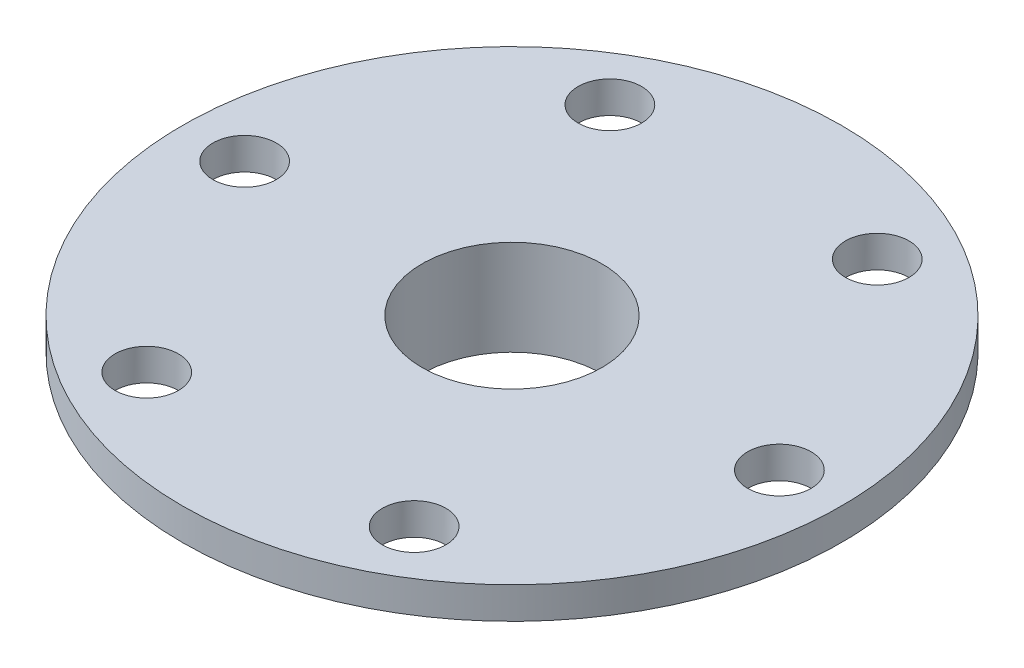
ISO-10303-21;
HEADER;
FILE_DESCRIPTION(('STEP AP214'),'2;1');
FILE_NAME('part.step','',(''),(''),'','','');
FILE_SCHEMA(('AUTOMOTIVE_DESIGN { 1 0 10303 214 1 1 1 1 }'));
ENDSEC;
DATA;
#1=APPLICATION_CONTEXT('core data for automotive mechanical design processes');
#2=APPLICATION_PROTOCOL_DEFINITION('international standard','automotive_design',2000,#1);
#3=PRODUCT_CONTEXT('',#1,'mechanical');
#4=PRODUCT('Part','Part','',(#3));
#5=PRODUCT_RELATED_PRODUCT_CATEGORY('part','',(#4));
#6=PRODUCT_DEFINITION_FORMATION('','',#4);
#7=PRODUCT_DEFINITION_CONTEXT('part definition',#1,'design');
#8=PRODUCT_DEFINITION('design','',#6,#7);
#9=PRODUCT_DEFINITION_SHAPE('','',#8);
#10=(LENGTH_UNIT() NAMED_UNIT(*) SI_UNIT(.MILLI.,.METRE.));
#11=(NAMED_UNIT(*) PLANE_ANGLE_UNIT() SI_UNIT($,.RADIAN.));
#12=(NAMED_UNIT(*) SI_UNIT($,.STERADIAN.) SOLID_ANGLE_UNIT());
#13=UNCERTAINTY_MEASURE_WITH_UNIT(LENGTH_MEASURE(1.E-05),#10,'distance_accuracy_value','');
#14=(GEOMETRIC_REPRESENTATION_CONTEXT(3) GLOBAL_UNCERTAINTY_ASSIGNED_CONTEXT((#13)) GLOBAL_UNIT_ASSIGNED_CONTEXT((#10,
#11,#12)) REPRESENTATION_CONTEXT('',''));
#15=CARTESIAN_POINT('',(0.,0.,0.));
#16=DIRECTION('',(0.,0.,1.));
#17=DIRECTION('',(1.,0.,0.));
#18=AXIS2_PLACEMENT_3D('',#15,#16,#17);
#19=CARTESIAN_POINT('',(0.,27.2792430533376,0.));
#20=DIRECTION('',(0.,1.,0.));
#21=DIRECTION('',(0.,0.,1.));
#22=AXIS2_PLACEMENT_3D('',#19,#20,#21);
#23=CYLINDRICAL_SURFACE('',#22,8.5);
#24=CARTESIAN_POINT('',(0.,0.,0.));
#25=DIRECTION('',(0.,1.,0.));
#26=DIRECTION('',(0.,0.,1.));
#27=AXIS2_PLACEMENT_3D('',#24,#25,#26);
#28=CIRCLE('',#27,8.5);
#29=CARTESIAN_POINT('',(0.,0.,8.5));
#30=VERTEX_POINT('',#29);
#31=EDGE_CURVE('E10',#30,#30,#28,.T.);
#32=ORIENTED_EDGE('',*,*,#31,.T.);
#33=EDGE_LOOP('',(#32));
#34=FACE_BOUND('',#33,.T.);
#35=CARTESIAN_POINT('',(0.,-9.00000000000001,0.));
#36=DIRECTION('',(0.,1.,0.));
#37=DIRECTION('',(0.,0.,1.));
#38=AXIS2_PLACEMENT_3D('',#35,#36,#37);
#39=CIRCLE('',#38,8.5);
#40=CARTESIAN_POINT('',(0.,-9.00000000000001,8.5));
#41=VERTEX_POINT('',#40);
#42=EDGE_CURVE('E70',#41,#41,#39,.T.);
#43=ORIENTED_EDGE('',*,*,#42,.F.);
#44=EDGE_LOOP('',(#43));
#45=FACE_BOUND('',#44,.T.);
#46=ADVANCED_FACE('F37',(#34,#45),#23,.F.);
#47=CARTESIAN_POINT('',(-8.5,0.,0.));
#48=DIRECTION('',(0.,1.,0.));
#49=DIRECTION('',(0.,0.,1.));
#50=AXIS2_PLACEMENT_3D('',#47,#48,#49);
#51=PLANE('',#50);
#52=CARTESIAN_POINT('',(-25.26875,0.,0.));
#53=DIRECTION('',(0.,1.,0.));
#54=DIRECTION('',(0.,0.,1.));
#55=AXIS2_PLACEMENT_3D('',#52,#53,#54);
#56=CIRCLE('',#55,3.);
#57=CARTESIAN_POINT('',(-25.26875,0.,3.));
#58=VERTEX_POINT('',#57);
#59=EDGE_CURVE('E57',#58,#58,#56,.T.);
#60=ORIENTED_EDGE('',*,*,#59,.F.);
#61=EDGE_LOOP('',(#60));
#62=FACE_BOUND('',#61,.T.);
#63=CARTESIAN_POINT('',(-12.634375,0.,21.883379421878));
#64=DIRECTION('',(0.,1.,0.));
#65=DIRECTION('',(0.,0.,1.));
#66=AXIS2_PLACEMENT_3D('',#63,#64,#65);
#67=CIRCLE('',#66,3.);
#68=CARTESIAN_POINT('',(-12.634375,0.,24.883379421878));
#69=VERTEX_POINT('',#68);
#70=EDGE_CURVE('E121',#69,#69,#67,.T.);
#71=ORIENTED_EDGE('',*,*,#70,.F.);
#72=EDGE_LOOP('',(#71));
#73=FACE_BOUND('',#72,.T.);
#74=CARTESIAN_POINT('',(12.634375,0.,21.883379421878));
#75=DIRECTION('',(0.,1.,0.));
#76=DIRECTION('',(0.,0.,1.));
#77=AXIS2_PLACEMENT_3D('',#74,#75,#76);
#78=CIRCLE('',#77,3.);
#79=CARTESIAN_POINT('',(12.634375,0.,24.883379421878));
#80=VERTEX_POINT('',#79);
#81=EDGE_CURVE('E82',#80,#80,#78,.T.);
#82=ORIENTED_EDGE('',*,*,#81,.F.);
#83=EDGE_LOOP('',(#82));
#84=FACE_BOUND('',#83,.T.);
#85=CARTESIAN_POINT('',(25.26875,0.,0.));
#86=DIRECTION('',(0.,1.,0.));
#87=DIRECTION('',(0.,0.,1.));
#88=AXIS2_PLACEMENT_3D('',#85,#86,#87);
#89=CIRCLE('',#88,3.);
#90=CARTESIAN_POINT('',(25.26875,0.,3.));
#91=VERTEX_POINT('',#90);
#92=EDGE_CURVE('E128',#91,#91,#89,.T.);
#93=ORIENTED_EDGE('',*,*,#92,.F.);
#94=EDGE_LOOP('',(#93));
#95=FACE_BOUND('',#94,.T.);
#96=CARTESIAN_POINT('',(12.634375,0.,-21.883379421878));
#97=DIRECTION('',(0.,1.,0.));
#98=DIRECTION('',(0.,0.,1.));
#99=AXIS2_PLACEMENT_3D('',#96,#97,#98);
#100=CIRCLE('',#99,3.);
#101=CARTESIAN_POINT('',(12.634375,0.,-18.883379421878));
#102=VERTEX_POINT('',#101);
#103=EDGE_CURVE('E132',#102,#102,#100,.T.);
#104=ORIENTED_EDGE('',*,*,#103,.F.);
#105=EDGE_LOOP('',(#104));
#106=FACE_BOUND('',#105,.T.);
#107=CARTESIAN_POINT('',(-12.634375,0.,-21.883379421878));
#108=DIRECTION('',(0.,1.,0.));
#109=DIRECTION('',(0.,0.,1.));
#110=AXIS2_PLACEMENT_3D('',#107,#108,#109);
#111=CIRCLE('',#110,3.);
#112=CARTESIAN_POINT('',(-12.634375,0.,-18.883379421878));
#113=VERTEX_POINT('',#112);
#114=EDGE_CURVE('E136',#113,#113,#111,.T.);
#115=ORIENTED_EDGE('',*,*,#114,.F.);
#116=EDGE_LOOP('',(#115));
#117=FACE_BOUND('',#116,.T.);
#118=CARTESIAN_POINT('',(0.,0.,0.));
#119=DIRECTION('',(0.,1.,0.));
#120=DIRECTION('',(0.,0.,1.));
#121=AXIS2_PLACEMENT_3D('',#118,#119,#120);
#122=CIRCLE('',#121,31.14375);
#123=CARTESIAN_POINT('',(0.,0.,31.14375));
#124=VERTEX_POINT('',#123);
#125=EDGE_CURVE('E44',#124,#124,#122,.T.);
#126=ORIENTED_EDGE('',*,*,#125,.T.);
#127=EDGE_LOOP('',(#126));
#128=FACE_BOUND('',#127,.T.);
#129=ORIENTED_EDGE('',*,*,#31,.F.);
#130=EDGE_LOOP('',(#129));
#131=FACE_BOUND('',#130,.T.);
#132=ADVANCED_FACE('F104',(#62,#73,#84,#95,#106,#117,#128,#131),#51,.T.);
#133=CARTESIAN_POINT('',(0.,27.2792430533376,0.));
#134=DIRECTION('',(0.,1.,0.));
#135=DIRECTION('',(0.,0.,1.));
#136=AXIS2_PLACEMENT_3D('',#133,#134,#135);
#137=CYLINDRICAL_SURFACE('',#136,31.14375);
#138=CARTESIAN_POINT('',(0.,-3.,0.));
#139=DIRECTION('',(0.,1.,0.));
#140=DIRECTION('',(0.,0.,1.));
#141=AXIS2_PLACEMENT_3D('',#138,#139,#140);
#142=CIRCLE('',#141,31.14375);
#143=CARTESIAN_POINT('',(0.,-3.,31.14375));
#144=VERTEX_POINT('',#143);
#145=EDGE_CURVE('E49',#144,#144,#142,.T.);
#146=ORIENTED_EDGE('',*,*,#145,.T.);
#147=EDGE_LOOP('',(#146));
#148=FACE_BOUND('',#147,.T.);
#149=ORIENTED_EDGE('',*,*,#125,.F.);
#150=EDGE_LOOP('',(#149));
#151=FACE_BOUND('',#150,.T.);
#152=ADVANCED_FACE('F89',(#148,#151),#137,.T.);
#153=CARTESIAN_POINT('',(-31.14375,-3.,0.));
#154=DIRECTION('',(0.,-1.,0.));
#155=DIRECTION('',(0.,0.,-1.));
#156=AXIS2_PLACEMENT_3D('',#153,#154,#155);
#157=PLANE('',#156);
#158=CARTESIAN_POINT('',(-25.26875,-3.,0.));
#159=DIRECTION('',(0.,-1.,0.));
#160=DIRECTION('',(0.,0.,-1.));
#161=AXIS2_PLACEMENT_3D('',#158,#159,#160);
#162=CIRCLE('',#161,3.);
#163=CARTESIAN_POINT('',(-25.26875,-3.,-3.));
#164=VERTEX_POINT('',#163);
#165=EDGE_CURVE('E40',#164,#164,#162,.T.);
#166=ORIENTED_EDGE('',*,*,#165,.F.);
#167=EDGE_LOOP('',(#166));
#168=FACE_BOUND('',#167,.T.);
#169=CARTESIAN_POINT('',(-12.634375,-3.,21.883379421878));
#170=DIRECTION('',(0.,-1.,0.));
#171=DIRECTION('',(0.,0.,-1.));
#172=AXIS2_PLACEMENT_3D('',#169,#170,#171);
#173=CIRCLE('',#172,3.);
#174=CARTESIAN_POINT('',(-12.634375,-3.,18.883379421878));
#175=VERTEX_POINT('',#174);
#176=EDGE_CURVE('E65',#175,#175,#173,.T.);
#177=ORIENTED_EDGE('',*,*,#176,.F.);
#178=EDGE_LOOP('',(#177));
#179=FACE_BOUND('',#178,.T.);
#180=CARTESIAN_POINT('',(12.634375,-3.,21.883379421878));
#181=DIRECTION('',(0.,-1.,0.));
#182=DIRECTION('',(0.,0.,-1.));
#183=AXIS2_PLACEMENT_3D('',#180,#181,#182);
#184=CIRCLE('',#183,3.);
#185=CARTESIAN_POINT('',(12.634375,-3.,18.883379421878));
#186=VERTEX_POINT('',#185);
#187=EDGE_CURVE('E63',#186,#186,#184,.T.);
#188=ORIENTED_EDGE('',*,*,#187,.F.);
#189=EDGE_LOOP('',(#188));
#190=FACE_BOUND('',#189,.T.);
#191=CARTESIAN_POINT('',(25.26875,-3.,0.));
#192=DIRECTION('',(0.,-1.,0.));
#193=DIRECTION('',(0.,0.,-1.));
#194=AXIS2_PLACEMENT_3D('',#191,#192,#193);
#195=CIRCLE('',#194,3.);
#196=CARTESIAN_POINT('',(25.26875,-3.,-3.));
#197=VERTEX_POINT('',#196);
#198=EDGE_CURVE('E60',#197,#197,#195,.T.);
#199=ORIENTED_EDGE('',*,*,#198,.F.);
#200=EDGE_LOOP('',(#199));
#201=FACE_BOUND('',#200,.T.);
#202=CARTESIAN_POINT('',(12.634375,-3.,-21.883379421878));
#203=DIRECTION('',(0.,-1.,0.));
#204=DIRECTION('',(0.,0.,-1.));
#205=AXIS2_PLACEMENT_3D('',#202,#203,#204);
#206=CIRCLE('',#205,3.);
#207=CARTESIAN_POINT('',(12.634375,-3.,-24.883379421878));
#208=VERTEX_POINT('',#207);
#209=EDGE_CURVE('E56',#208,#208,#206,.T.);
#210=ORIENTED_EDGE('',*,*,#209,.F.);
#211=EDGE_LOOP('',(#210));
#212=FACE_BOUND('',#211,.T.);
#213=CARTESIAN_POINT('',(-12.634375,-3.,-21.883379421878));
#214=DIRECTION('',(0.,-1.,0.));
#215=DIRECTION('',(0.,0.,-1.));
#216=AXIS2_PLACEMENT_3D('',#213,#214,#215);
#217=CIRCLE('',#216,3.);
#218=CARTESIAN_POINT('',(-12.634375,-3.,-24.883379421878));
#219=VERTEX_POINT('',#218);
#220=EDGE_CURVE('E53',#219,#219,#217,.T.);
#221=ORIENTED_EDGE('',*,*,#220,.F.);
#222=EDGE_LOOP('',(#221));
#223=FACE_BOUND('',#222,.T.);
#224=CARTESIAN_POINT('',(0.,-3.,0.));
#225=DIRECTION('',(0.,1.,0.));
#226=DIRECTION('',(0.,0.,1.));
#227=AXIS2_PLACEMENT_3D('',#224,#225,#226);
#228=CIRCLE('',#227,12.25);
#229=CARTESIAN_POINT('',(0.,-3.,12.25));
#230=VERTEX_POINT('',#229);
#231=EDGE_CURVE('E79',#230,#230,#228,.T.);
#232=ORIENTED_EDGE('',*,*,#231,.T.);
#233=EDGE_LOOP('',(#232));
#234=FACE_BOUND('',#233,.T.);
#235=ORIENTED_EDGE('',*,*,#145,.F.);
#236=EDGE_LOOP('',(#235));
#237=FACE_BOUND('',#236,.T.);
#238=ADVANCED_FACE('F92',(#168,#179,#190,#201,#212,#223,#234,#237),#157,.T.);
#239=CARTESIAN_POINT('',(0.,27.2792430533376,0.));
#240=DIRECTION('',(0.,1.,0.));
#241=DIRECTION('',(0.,0.,1.));
#242=AXIS2_PLACEMENT_3D('',#239,#240,#241);
#243=CYLINDRICAL_SURFACE('',#242,12.25);
#244=CARTESIAN_POINT('',(0.,-9.,0.));
#245=DIRECTION('',(0.,1.,0.));
#246=DIRECTION('',(0.,0.,1.));
#247=AXIS2_PLACEMENT_3D('',#244,#245,#246);
#248=CIRCLE('',#247,12.25);
#249=CARTESIAN_POINT('',(0.,-9.,12.25));
#250=VERTEX_POINT('',#249);
#251=EDGE_CURVE('E74',#250,#250,#248,.T.);
#252=ORIENTED_EDGE('',*,*,#251,.T.);
#253=EDGE_LOOP('',(#252));
#254=FACE_BOUND('',#253,.T.);
#255=ORIENTED_EDGE('',*,*,#231,.F.);
#256=EDGE_LOOP('',(#255));
#257=FACE_BOUND('',#256,.T.);
#258=ADVANCED_FACE('F94',(#254,#257),#243,.T.);
#259=CARTESIAN_POINT('',(-12.25,-9.00000000000001,0.));
#260=DIRECTION('',(0.,-1.,0.));
#261=DIRECTION('',(0.,0.,-1.));
#262=AXIS2_PLACEMENT_3D('',#259,#260,#261);
#263=PLANE('',#262);
#264=ORIENTED_EDGE('',*,*,#42,.T.);
#265=EDGE_LOOP('',(#264));
#266=FACE_BOUND('',#265,.T.);
#267=ORIENTED_EDGE('',*,*,#251,.F.);
#268=EDGE_LOOP('',(#267));
#269=FACE_BOUND('',#268,.T.);
#270=ADVANCED_FACE('F101',(#266,#269),#263,.T.);
#271=CARTESIAN_POINT('',(-12.634375,-9.00000000000001,-21.883379421878));
#272=DIRECTION('',(0.,1.,0.));
#273=DIRECTION('',(0.,0.,1.));
#274=AXIS2_PLACEMENT_3D('',#271,#272,#273);
#275=CYLINDRICAL_SURFACE('',#274,3.);
#276=ORIENTED_EDGE('',*,*,#220,.T.);
#277=EDGE_LOOP('',(#276));
#278=FACE_BOUND('',#277,.T.);
#279=ORIENTED_EDGE('',*,*,#114,.T.);
#280=EDGE_LOOP('',(#279));
#281=FACE_BOUND('',#280,.T.);
#282=ADVANCED_FACE('F161',(#278,#281),#275,.F.);
#283=CARTESIAN_POINT('',(12.634375,-9.00000000000001,-21.883379421878));
#284=DIRECTION('',(0.,1.,0.));
#285=DIRECTION('',(0.,0.,1.));
#286=AXIS2_PLACEMENT_3D('',#283,#284,#285);
#287=CYLINDRICAL_SURFACE('',#286,3.);
#288=ORIENTED_EDGE('',*,*,#209,.T.);
#289=EDGE_LOOP('',(#288));
#290=FACE_BOUND('',#289,.T.);
#291=ORIENTED_EDGE('',*,*,#103,.T.);
#292=EDGE_LOOP('',(#291));
#293=FACE_BOUND('',#292,.T.);
#294=ADVANCED_FACE('F164',(#290,#293),#287,.F.);
#295=CARTESIAN_POINT('',(25.26875,-9.00000000000001,0.));
#296=DIRECTION('',(0.,1.,0.));
#297=DIRECTION('',(0.,0.,1.));
#298=AXIS2_PLACEMENT_3D('',#295,#296,#297);
#299=CYLINDRICAL_SURFACE('',#298,3.);
#300=ORIENTED_EDGE('',*,*,#198,.T.);
#301=EDGE_LOOP('',(#300));
#302=FACE_BOUND('',#301,.T.);
#303=ORIENTED_EDGE('',*,*,#92,.T.);
#304=EDGE_LOOP('',(#303));
#305=FACE_BOUND('',#304,.T.);
#306=ADVANCED_FACE('F157',(#302,#305),#299,.F.);
#307=CARTESIAN_POINT('',(12.634375,-9.00000000000001,21.883379421878));
#308=DIRECTION('',(0.,1.,0.));
#309=DIRECTION('',(0.,0.,1.));
#310=AXIS2_PLACEMENT_3D('',#307,#308,#309);
#311=CYLINDRICAL_SURFACE('',#310,3.);
#312=ORIENTED_EDGE('',*,*,#187,.T.);
#313=EDGE_LOOP('',(#312));
#314=FACE_BOUND('',#313,.T.);
#315=ORIENTED_EDGE('',*,*,#81,.T.);
#316=EDGE_LOOP('',(#315));
#317=FACE_BOUND('',#316,.T.);
#318=ADVANCED_FACE('F150',(#314,#317),#311,.F.);
#319=CARTESIAN_POINT('',(-12.634375,-9.00000000000001,21.883379421878));
#320=DIRECTION('',(0.,1.,0.));
#321=DIRECTION('',(0.,0.,1.));
#322=AXIS2_PLACEMENT_3D('',#319,#320,#321);
#323=CYLINDRICAL_SURFACE('',#322,3.);
#324=ORIENTED_EDGE('',*,*,#176,.T.);
#325=EDGE_LOOP('',(#324));
#326=FACE_BOUND('',#325,.T.);
#327=ORIENTED_EDGE('',*,*,#70,.T.);
#328=EDGE_LOOP('',(#327));
#329=FACE_BOUND('',#328,.T.);
#330=ADVANCED_FACE('F147',(#326,#329),#323,.F.);
#331=CARTESIAN_POINT('',(-25.26875,-9.00000000000001,0.));
#332=DIRECTION('',(0.,1.,0.));
#333=DIRECTION('',(0.,0.,1.));
#334=AXIS2_PLACEMENT_3D('',#331,#332,#333);
#335=CYLINDRICAL_SURFACE('',#334,3.);
#336=ORIENTED_EDGE('',*,*,#165,.T.);
#337=EDGE_LOOP('',(#336));
#338=FACE_BOUND('',#337,.T.);
#339=ORIENTED_EDGE('',*,*,#59,.T.);
#340=EDGE_LOOP('',(#339));
#341=FACE_BOUND('',#340,.T.);
#342=ADVANCED_FACE('F149',(#338,#341),#335,.F.);
#343=CLOSED_SHELL('',(#46,#132,#152,#238,#258,#270,#282,#294,#306,#318,#330,#342));
#344=MANIFOLD_SOLID_BREP('B2',#343);
#345=ADVANCED_BREP_SHAPE_REPRESENTATION('',(#18,#344),#14);
#346=SHAPE_DEFINITION_REPRESENTATION(#9,#345);
ENDSEC;
END-ISO-10303-21;
